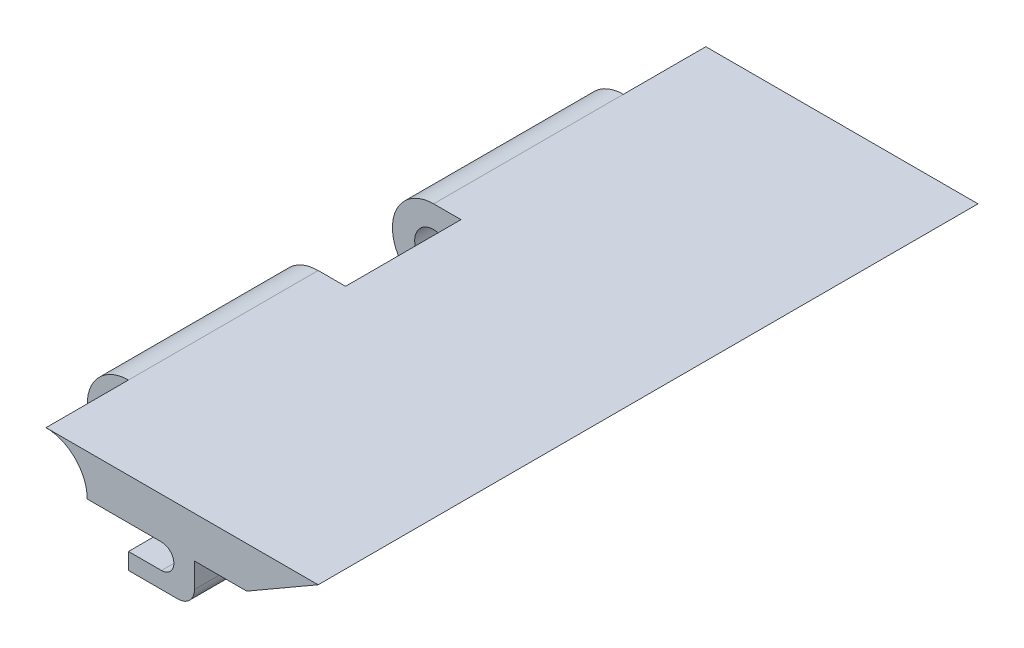
ISO-10303-21;
HEADER;
FILE_DESCRIPTION(('STEP AP214'),'2;1');
FILE_NAME('part.step','',(''),(''),'','','');
FILE_SCHEMA(('AUTOMOTIVE_DESIGN { 1 0 10303 214 1 1 1 1 }'));
ENDSEC;
DATA;
#1=APPLICATION_CONTEXT('core data for automotive mechanical design processes');
#2=APPLICATION_PROTOCOL_DEFINITION('international standard','automotive_design',2000,#1);
#3=PRODUCT_CONTEXT('',#1,'mechanical');
#4=PRODUCT('Part','Part','',(#3));
#5=PRODUCT_RELATED_PRODUCT_CATEGORY('part','',(#4));
#6=PRODUCT_DEFINITION_FORMATION('','',#4);
#7=PRODUCT_DEFINITION_CONTEXT('part definition',#1,'design');
#8=PRODUCT_DEFINITION('design','',#6,#7);
#9=PRODUCT_DEFINITION_SHAPE('','',#8);
#10=(LENGTH_UNIT() NAMED_UNIT(*) SI_UNIT(.MILLI.,.METRE.));
#11=(NAMED_UNIT(*) PLANE_ANGLE_UNIT() SI_UNIT($,.RADIAN.));
#12=(NAMED_UNIT(*) SI_UNIT($,.STERADIAN.) SOLID_ANGLE_UNIT());
#13=UNCERTAINTY_MEASURE_WITH_UNIT(LENGTH_MEASURE(1.E-05),#10,'distance_accuracy_value','');
#14=(GEOMETRIC_REPRESENTATION_CONTEXT(3) GLOBAL_UNCERTAINTY_ASSIGNED_CONTEXT((#13)) GLOBAL_UNIT_ASSIGNED_CONTEXT((#10,
#11,#12)) REPRESENTATION_CONTEXT('',''));
#15=CARTESIAN_POINT('',(0.,0.,0.));
#16=DIRECTION('',(0.,0.,1.));
#17=DIRECTION('',(1.,0.,0.));
#18=AXIS2_PLACEMENT_3D('',#15,#16,#17);
#19=CARTESIAN_POINT('',(7.,-0.75,20.));
#20=DIRECTION('',(0.,0.,-1.));
#21=DIRECTION('',(-1.,0.,0.));
#22=AXIS2_PLACEMENT_3D('',#19,#20,#21);
#23=CYLINDRICAL_SURFACE('',#22,0.75);
#24=CARTESIAN_POINT('',(7.,-0.75,-12.));
#25=DIRECTION('',(0.,0.,-1.));
#26=DIRECTION('',(-1.,0.,0.));
#27=AXIS2_PLACEMENT_3D('',#24,#25,#26);
#28=CIRCLE('',#27,0.75);
#29=CARTESIAN_POINT('',(7.,-1.5,-12.));
#30=VERTEX_POINT('',#29);
#31=CARTESIAN_POINT('',(7.,0.,-12.));
#32=VERTEX_POINT('',#31);
#33=EDGE_CURVE('E450',#30,#32,#28,.F.);
#34=ORIENTED_EDGE('',*,*,#33,.F.);
#35=DIRECTION('',(0.,0.,-1.));
#36=VECTOR('',#35,1.);
#37=CARTESIAN_POINT('',(7.,-1.5,20.));
#38=LINE('',#37,#36);
#39=CARTESIAN_POINT('',(7.,-1.5,12.));
#40=VERTEX_POINT('',#39);
#41=EDGE_CURVE('E257',#40,#30,#38,.T.);
#42=ORIENTED_EDGE('',*,*,#41,.F.);
#43=CARTESIAN_POINT('',(7.,-0.75,12.));
#44=DIRECTION('',(0.,0.,1.));
#45=DIRECTION('',(1.,0.,0.));
#46=AXIS2_PLACEMENT_3D('',#43,#44,#45);
#47=CIRCLE('',#46,0.75);
#48=CARTESIAN_POINT('',(7.,0.,12.));
#49=VERTEX_POINT('',#48);
#50=EDGE_CURVE('E244',#49,#40,#47,.F.);
#51=ORIENTED_EDGE('',*,*,#50,.F.);
#52=DIRECTION('',(0.,0.,-1.));
#53=VECTOR('',#52,1.);
#54=CARTESIAN_POINT('',(7.,0.,20.));
#55=LINE('',#54,#53);
#56=EDGE_CURVE('E255',#49,#32,#55,.T.);
#57=ORIENTED_EDGE('',*,*,#56,.T.);
#58=EDGE_LOOP('',(#34,#42,#51,#57));
#59=FACE_BOUND('',#58,.T.);
#60=ADVANCED_FACE('F41',(#59),#23,.F.);
#61=CARTESIAN_POINT('',(7.,-0.75,-15.));
#62=DIRECTION('',(0.,0.,1.));
#63=DIRECTION('',(1.,0.,0.));
#64=AXIS2_PLACEMENT_3D('',#61,#62,#63);
#65=CIRCLE('',#64,0.75);
#66=CARTESIAN_POINT('',(7.,0.,-15.));
#67=VERTEX_POINT('',#66);
#68=CARTESIAN_POINT('',(7.,-1.5,-15.));
#69=VERTEX_POINT('',#68);
#70=EDGE_CURVE('E440',#67,#69,#65,.F.);
#71=ORIENTED_EDGE('',*,*,#70,.F.);
#72=CARTESIAN_POINT('',(7.,0.,-20.));
#73=VERTEX_POINT('',#72);
#74=EDGE_CURVE('E265',#67,#73,#55,.T.);
#75=ORIENTED_EDGE('',*,*,#74,.T.);
#76=CARTESIAN_POINT('',(7.,-0.75,-20.));
#77=DIRECTION('',(0.,0.,-1.));
#78=DIRECTION('',(-1.,0.,0.));
#79=AXIS2_PLACEMENT_3D('',#76,#77,#78);
#80=CIRCLE('',#79,0.75);
#81=CARTESIAN_POINT('',(7.,-1.5,-20.));
#82=VERTEX_POINT('',#81);
#83=EDGE_CURVE('E484',#73,#82,#80,.T.);
#84=ORIENTED_EDGE('',*,*,#83,.T.);
#85=EDGE_CURVE('E404',#69,#82,#38,.T.);
#86=ORIENTED_EDGE('',*,*,#85,.F.);
#87=EDGE_LOOP('',(#71,#75,#84,#86));
#88=FACE_BOUND('',#87,.T.);
#89=ADVANCED_FACE('F571',(#88),#23,.F.);
#90=CARTESIAN_POINT('',(7.,-0.75,15.));
#91=DIRECTION('',(0.,0.,-1.));
#92=DIRECTION('',(-1.,0.,0.));
#93=AXIS2_PLACEMENT_3D('',#90,#91,#92);
#94=CIRCLE('',#93,0.75);
#95=CARTESIAN_POINT('',(7.,-1.5,15.));
#96=VERTEX_POINT('',#95);
#97=CARTESIAN_POINT('',(7.,0.,15.));
#98=VERTEX_POINT('',#97);
#99=EDGE_CURVE('E426',#96,#98,#94,.F.);
#100=ORIENTED_EDGE('',*,*,#99,.F.);
#101=CARTESIAN_POINT('',(7.,-1.5,20.));
#102=VERTEX_POINT('',#101);
#103=EDGE_CURVE('E269',#102,#96,#38,.T.);
#104=ORIENTED_EDGE('',*,*,#103,.F.);
#105=CARTESIAN_POINT('',(7.,-0.75,20.));
#106=DIRECTION('',(0.,0.,-1.));
#107=DIRECTION('',(-1.,0.,0.));
#108=AXIS2_PLACEMENT_3D('',#105,#106,#107);
#109=CIRCLE('',#108,0.75);
#110=CARTESIAN_POINT('',(7.,0.,20.));
#111=VERTEX_POINT('',#110);
#112=EDGE_CURVE('E425',#111,#102,#109,.T.);
#113=ORIENTED_EDGE('',*,*,#112,.F.);
#114=EDGE_CURVE('E264',#111,#98,#55,.T.);
#115=ORIENTED_EDGE('',*,*,#114,.T.);
#116=EDGE_LOOP('',(#100,#104,#113,#115));
#117=FACE_BOUND('',#116,.T.);
#118=ADVANCED_FACE('F424',(#117),#23,.F.);
#119=CARTESIAN_POINT('',(7.,-1.5,20.));
#120=DIRECTION('',(0.,-1.,0.));
#121=DIRECTION('',(1.,0.,0.));
#122=AXIS2_PLACEMENT_3D('',#119,#120,#121);
#123=PLANE('',#122);
#124=DIRECTION('',(1.,0.,0.));
#125=VECTOR('',#124,1.);
#126=CARTESIAN_POINT('',(7.00000000000001,-1.5,-12.));
#127=LINE('',#126,#125);
#128=CARTESIAN_POINT('',(5.,-1.5,-12.));
#129=VERTEX_POINT('',#128);
#130=EDGE_CURVE('E448',#129,#30,#127,.T.);
#131=ORIENTED_EDGE('',*,*,#130,.F.);
#132=DIRECTION('',(0.,0.,-1.));
#133=VECTOR('',#132,1.);
#134=CARTESIAN_POINT('',(5.,-1.5,20.));
#135=LINE('',#134,#133);
#136=CARTESIAN_POINT('',(5.,-1.5,12.));
#137=VERTEX_POINT('',#136);
#138=EDGE_CURVE('E396',#137,#129,#135,.T.);
#139=ORIENTED_EDGE('',*,*,#138,.F.);
#140=DIRECTION('',(-1.,0.,0.));
#141=VECTOR('',#140,1.);
#142=CARTESIAN_POINT('',(7.,-1.5,12.));
#143=LINE('',#142,#141);
#144=EDGE_CURVE('E259',#40,#137,#143,.T.);
#145=ORIENTED_EDGE('',*,*,#144,.F.);
#146=ORIENTED_EDGE('',*,*,#41,.T.);
#147=EDGE_LOOP('',(#131,#139,#145,#146));
#148=FACE_BOUND('',#147,.T.);
#149=ADVANCED_FACE('F546',(#148),#123,.F.);
#150=DIRECTION('',(-1.,0.,0.));
#151=VECTOR('',#150,1.);
#152=CARTESIAN_POINT('',(6.99999999999999,-1.5,-15.));
#153=LINE('',#152,#151);
#154=CARTESIAN_POINT('',(5.,-1.5,-15.));
#155=VERTEX_POINT('',#154);
#156=EDGE_CURVE('E438',#69,#155,#153,.T.);
#157=ORIENTED_EDGE('',*,*,#156,.F.);
#158=ORIENTED_EDGE('',*,*,#85,.T.);
#159=DIRECTION('',(-1.,0.,0.));
#160=VECTOR('',#159,1.);
#161=CARTESIAN_POINT('',(7.,-1.5,-20.));
#162=LINE('',#161,#160);
#163=CARTESIAN_POINT('',(5.,-1.5,-20.));
#164=VERTEX_POINT('',#163);
#165=EDGE_CURVE('E493',#82,#164,#162,.T.);
#166=ORIENTED_EDGE('',*,*,#165,.T.);
#167=EDGE_CURVE('E391',#155,#164,#135,.T.);
#168=ORIENTED_EDGE('',*,*,#167,.F.);
#169=EDGE_LOOP('',(#157,#158,#166,#168));
#170=FACE_BOUND('',#169,.T.);
#171=ADVANCED_FACE('F584',(#170),#123,.F.);
#172=DIRECTION('',(1.,0.,0.));
#173=VECTOR('',#172,1.);
#174=CARTESIAN_POINT('',(7.,-1.5,15.));
#175=LINE('',#174,#173);
#176=CARTESIAN_POINT('',(5.,-1.5,15.));
#177=VERTEX_POINT('',#176);
#178=EDGE_CURVE('E419',#177,#96,#175,.T.);
#179=ORIENTED_EDGE('',*,*,#178,.F.);
#180=CARTESIAN_POINT('',(5.,-1.5,20.));
#181=VERTEX_POINT('',#180);
#182=EDGE_CURVE('E397',#181,#177,#135,.T.);
#183=ORIENTED_EDGE('',*,*,#182,.F.);
#184=DIRECTION('',(-1.,0.,0.));
#185=VECTOR('',#184,1.);
#186=CARTESIAN_POINT('',(7.,-1.5,20.));
#187=LINE('',#186,#185);
#188=EDGE_CURVE('E420',#102,#181,#187,.T.);
#189=ORIENTED_EDGE('',*,*,#188,.F.);
#190=ORIENTED_EDGE('',*,*,#103,.T.);
#191=EDGE_LOOP('',(#179,#183,#189,#190));
#192=FACE_BOUND('',#191,.T.);
#193=ADVANCED_FACE('F418',(#192),#123,.F.);
#194=CARTESIAN_POINT('',(5.,-1.5,20.));
#195=DIRECTION('',(1.,0.,0.));
#196=DIRECTION('',(0.,0.,-1.));
#197=AXIS2_PLACEMENT_3D('',#194,#195,#196);
#198=PLANE('',#197);
#199=DIRECTION('',(0.,1.,0.));
#200=VECTOR('',#199,1.);
#201=CARTESIAN_POINT('',(5.,-1.5,-12.));
#202=LINE('',#201,#200);
#203=CARTESIAN_POINT('',(5.,-2.5,-12.));
#204=VERTEX_POINT('',#203);
#205=EDGE_CURVE('E446',#204,#129,#202,.T.);
#206=ORIENTED_EDGE('',*,*,#205,.F.);
#207=DIRECTION('',(0.,0.,-1.));
#208=VECTOR('',#207,1.);
#209=CARTESIAN_POINT('',(5.,-2.5,20.));
#210=LINE('',#209,#208);
#211=CARTESIAN_POINT('',(5.,-2.5,12.));
#212=VERTEX_POINT('',#211);
#213=EDGE_CURVE('E383',#212,#204,#210,.T.);
#214=ORIENTED_EDGE('',*,*,#213,.F.);
#215=DIRECTION('',(0.,-1.,0.));
#216=VECTOR('',#215,1.);
#217=CARTESIAN_POINT('',(5.,-1.5,12.));
#218=LINE('',#217,#216);
#219=EDGE_CURVE('E536',#137,#212,#218,.T.);
#220=ORIENTED_EDGE('',*,*,#219,.F.);
#221=ORIENTED_EDGE('',*,*,#138,.T.);
#222=EDGE_LOOP('',(#206,#214,#220,#221));
#223=FACE_BOUND('',#222,.T.);
#224=ADVANCED_FACE('F544',(#223),#198,.F.);
#225=DIRECTION('',(0.,-1.,0.));
#226=VECTOR('',#225,1.);
#227=CARTESIAN_POINT('',(5.,-1.5,-15.));
#228=LINE('',#227,#226);
#229=CARTESIAN_POINT('',(5.,-2.5,-15.));
#230=VERTEX_POINT('',#229);
#231=EDGE_CURVE('E436',#155,#230,#228,.T.);
#232=ORIENTED_EDGE('',*,*,#231,.F.);
#233=ORIENTED_EDGE('',*,*,#167,.T.);
#234=DIRECTION('',(0.,-1.,0.));
#235=VECTOR('',#234,1.);
#236=CARTESIAN_POINT('',(5.,-1.5,-20.));
#237=LINE('',#236,#235);
#238=CARTESIAN_POINT('',(5.,-2.5,-20.));
#239=VERTEX_POINT('',#238);
#240=EDGE_CURVE('E495',#164,#239,#237,.T.);
#241=ORIENTED_EDGE('',*,*,#240,.T.);
#242=EDGE_CURVE('E378',#230,#239,#210,.T.);
#243=ORIENTED_EDGE('',*,*,#242,.F.);
#244=EDGE_LOOP('',(#232,#233,#241,#243));
#245=FACE_BOUND('',#244,.T.);
#246=ADVANCED_FACE('F593',(#245),#198,.F.);
#247=DIRECTION('',(0.,1.,0.));
#248=VECTOR('',#247,1.);
#249=CARTESIAN_POINT('',(5.,-1.5,15.));
#250=LINE('',#249,#248);
#251=CARTESIAN_POINT('',(5.,-2.5,15.));
#252=VERTEX_POINT('',#251);
#253=EDGE_CURVE('E431',#252,#177,#250,.T.);
#254=ORIENTED_EDGE('',*,*,#253,.F.);
#255=CARTESIAN_POINT('',(5.,-2.5,20.));
#256=VERTEX_POINT('',#255);
#257=EDGE_CURVE('E384',#256,#252,#210,.T.);
#258=ORIENTED_EDGE('',*,*,#257,.F.);
#259=DIRECTION('',(0.,-1.,0.));
#260=VECTOR('',#259,1.);
#261=CARTESIAN_POINT('',(5.,-1.5,20.));
#262=LINE('',#261,#260);
#263=EDGE_CURVE('E487',#181,#256,#262,.T.);
#264=ORIENTED_EDGE('',*,*,#263,.F.);
#265=ORIENTED_EDGE('',*,*,#182,.T.);
#266=EDGE_LOOP('',(#254,#258,#264,#265));
#267=FACE_BOUND('',#266,.T.);
#268=ADVANCED_FACE('F525',(#267),#198,.F.);
#269=CARTESIAN_POINT('',(5.,-2.5,20.));
#270=DIRECTION('',(0.,1.,0.));
#271=DIRECTION('',(-1.,0.,0.));
#272=AXIS2_PLACEMENT_3D('',#269,#270,#271);
#273=PLANE('',#272);
#274=DIRECTION('',(-1.,0.,0.));
#275=VECTOR('',#274,1.);
#276=CARTESIAN_POINT('',(5.00000000000001,-2.5,-12.));
#277=LINE('',#276,#275);
#278=CARTESIAN_POINT('',(8.,-2.5,-12.));
#279=VERTEX_POINT('',#278);
#280=EDGE_CURVE('E444',#279,#204,#277,.T.);
#281=ORIENTED_EDGE('',*,*,#280,.F.);
#282=DIRECTION('',(0.,0.,-1.));
#283=VECTOR('',#282,1.);
#284=CARTESIAN_POINT('',(8.,-2.5,20.));
#285=LINE('',#284,#283);
#286=CARTESIAN_POINT('',(8.,-2.5,12.));
#287=VERTEX_POINT('',#286);
#288=EDGE_CURVE('E370',#287,#279,#285,.T.);
#289=ORIENTED_EDGE('',*,*,#288,.F.);
#290=DIRECTION('',(1.,0.,0.));
#291=VECTOR('',#290,1.);
#292=CARTESIAN_POINT('',(5.,-2.5,12.));
#293=LINE('',#292,#291);
#294=EDGE_CURVE('E534',#212,#287,#293,.T.);
#295=ORIENTED_EDGE('',*,*,#294,.F.);
#296=ORIENTED_EDGE('',*,*,#213,.T.);
#297=EDGE_LOOP('',(#281,#289,#295,#296));
#298=FACE_BOUND('',#297,.T.);
#299=ADVANCED_FACE('F551',(#298),#273,.F.);
#300=DIRECTION('',(1.,0.,0.));
#301=VECTOR('',#300,1.);
#302=CARTESIAN_POINT('',(4.99999999999999,-2.5,-15.));
#303=LINE('',#302,#301);
#304=CARTESIAN_POINT('',(8.,-2.5,-15.));
#305=VERTEX_POINT('',#304);
#306=EDGE_CURVE('E429',#230,#305,#303,.T.);
#307=ORIENTED_EDGE('',*,*,#306,.F.);
#308=ORIENTED_EDGE('',*,*,#242,.T.);
#309=DIRECTION('',(1.,0.,0.));
#310=VECTOR('',#309,1.);
#311=CARTESIAN_POINT('',(5.,-2.5,-20.));
#312=LINE('',#311,#310);
#313=CARTESIAN_POINT('',(8.,-2.5,-20.));
#314=VERTEX_POINT('',#313);
#315=EDGE_CURVE('E497',#239,#314,#312,.T.);
#316=ORIENTED_EDGE('',*,*,#315,.T.);
#317=EDGE_CURVE('E365',#305,#314,#285,.T.);
#318=ORIENTED_EDGE('',*,*,#317,.F.);
#319=EDGE_LOOP('',(#307,#308,#316,#318));
#320=FACE_BOUND('',#319,.T.);
#321=ADVANCED_FACE('F602',(#320),#273,.F.);
#322=DIRECTION('',(-1.,0.,0.));
#323=VECTOR('',#322,1.);
#324=CARTESIAN_POINT('',(5.,-2.5,15.));
#325=LINE('',#324,#323);
#326=CARTESIAN_POINT('',(8.,-2.5,15.));
#327=VERTEX_POINT('',#326);
#328=EDGE_CURVE('E521',#327,#252,#325,.T.);
#329=ORIENTED_EDGE('',*,*,#328,.F.);
#330=CARTESIAN_POINT('',(8.,-2.5,20.));
#331=VERTEX_POINT('',#330);
#332=EDGE_CURVE('E371',#331,#327,#285,.T.);
#333=ORIENTED_EDGE('',*,*,#332,.F.);
#334=DIRECTION('',(1.,0.,0.));
#335=VECTOR('',#334,1.);
#336=CARTESIAN_POINT('',(5.,-2.5,20.));
#337=LINE('',#336,#335);
#338=EDGE_CURVE('E489',#256,#331,#337,.T.);
#339=ORIENTED_EDGE('',*,*,#338,.F.);
#340=ORIENTED_EDGE('',*,*,#257,.T.);
#341=EDGE_LOOP('',(#329,#333,#339,#340));
#342=FACE_BOUND('',#341,.T.);
#343=ADVANCED_FACE('F526',(#342),#273,.F.);
#344=CARTESIAN_POINT('',(8.,-1.5,20.));
#345=DIRECTION('',(0.,0.,-1.));
#346=DIRECTION('',(-1.,0.,0.));
#347=AXIS2_PLACEMENT_3D('',#344,#345,#346);
#348=CYLINDRICAL_SURFACE('',#347,1.);
#349=CARTESIAN_POINT('',(8.,-1.5,-12.));
#350=DIRECTION('',(0.,0.,-1.));
#351=DIRECTION('',(-1.,0.,0.));
#352=AXIS2_PLACEMENT_3D('',#349,#350,#351);
#353=CIRCLE('',#352,1.);
#354=CARTESIAN_POINT('',(9.,-1.5,-12.));
#355=VERTEX_POINT('',#354);
#356=EDGE_CURVE('E442',#355,#279,#353,.T.);
#357=ORIENTED_EDGE('',*,*,#356,.F.);
#358=DIRECTION('',(0.,0.,-1.));
#359=VECTOR('',#358,1.);
#360=CARTESIAN_POINT('',(9.,-1.5,20.));
#361=LINE('',#360,#359);
#362=CARTESIAN_POINT('',(9.,-1.5,12.));
#363=VERTEX_POINT('',#362);
#364=EDGE_CURVE('E359',#363,#355,#361,.T.);
#365=ORIENTED_EDGE('',*,*,#364,.F.);
#366=CARTESIAN_POINT('',(8.,-1.5,12.));
#367=DIRECTION('',(0.,0.,1.));
#368=DIRECTION('',(1.,0.,0.));
#369=AXIS2_PLACEMENT_3D('',#366,#367,#368);
#370=CIRCLE('',#369,1.);
#371=EDGE_CURVE('E532',#287,#363,#370,.T.);
#372=ORIENTED_EDGE('',*,*,#371,.F.);
#373=ORIENTED_EDGE('',*,*,#288,.T.);
#374=EDGE_LOOP('',(#357,#365,#372,#373));
#375=FACE_BOUND('',#374,.T.);
#376=ADVANCED_FACE('F557',(#375),#348,.T.);
#377=CARTESIAN_POINT('',(8.,-1.5,-15.));
#378=DIRECTION('',(0.,0.,1.));
#379=DIRECTION('',(1.,0.,0.));
#380=AXIS2_PLACEMENT_3D('',#377,#378,#379);
#381=CIRCLE('',#380,1.);
#382=CARTESIAN_POINT('',(9.,-1.5,-15.));
#383=VERTEX_POINT('',#382);
#384=EDGE_CURVE('E336',#305,#383,#381,.T.);
#385=ORIENTED_EDGE('',*,*,#384,.F.);
#386=ORIENTED_EDGE('',*,*,#317,.T.);
#387=CARTESIAN_POINT('',(8.,-1.5,-20.));
#388=DIRECTION('',(0.,0.,1.));
#389=DIRECTION('',(-1.,0.,0.));
#390=AXIS2_PLACEMENT_3D('',#387,#388,#389);
#391=CIRCLE('',#390,1.);
#392=CARTESIAN_POINT('',(9.,-1.5,-20.));
#393=VERTEX_POINT('',#392);
#394=EDGE_CURVE('E499',#314,#393,#391,.T.);
#395=ORIENTED_EDGE('',*,*,#394,.T.);
#396=EDGE_CURVE('E356',#383,#393,#361,.T.);
#397=ORIENTED_EDGE('',*,*,#396,.F.);
#398=EDGE_LOOP('',(#385,#386,#395,#397));
#399=FACE_BOUND('',#398,.T.);
#400=ADVANCED_FACE('F501',(#399),#348,.T.);
#401=CARTESIAN_POINT('',(8.,-1.5,15.));
#402=DIRECTION('',(0.,0.,-1.));
#403=DIRECTION('',(-1.,0.,0.));
#404=AXIS2_PLACEMENT_3D('',#401,#402,#403);
#405=CIRCLE('',#404,1.);
#406=CARTESIAN_POINT('',(9.,-1.5,15.));
#407=VERTEX_POINT('',#406);
#408=EDGE_CURVE('E258',#407,#327,#405,.T.);
#409=ORIENTED_EDGE('',*,*,#408,.F.);
#410=CARTESIAN_POINT('',(9.,-1.5,20.));
#411=VERTEX_POINT('',#410);
#412=EDGE_CURVE('E360',#411,#407,#361,.T.);
#413=ORIENTED_EDGE('',*,*,#412,.F.);
#414=CARTESIAN_POINT('',(8.,-1.5,20.));
#415=DIRECTION('',(0.,0.,1.));
#416=DIRECTION('',(-1.,0.,0.));
#417=AXIS2_PLACEMENT_3D('',#414,#415,#416);
#418=CIRCLE('',#417,1.);
#419=EDGE_CURVE('E351',#331,#411,#418,.T.);
#420=ORIENTED_EDGE('',*,*,#419,.F.);
#421=ORIENTED_EDGE('',*,*,#332,.T.);
#422=EDGE_LOOP('',(#409,#413,#420,#421));
#423=FACE_BOUND('',#422,.T.);
#424=ADVANCED_FACE('F520',(#423),#348,.T.);
#425=CARTESIAN_POINT('',(9.,-1.5,20.));
#426=DIRECTION('',(-1.,0.,0.));
#427=DIRECTION('',(0.,0.,1.));
#428=AXIS2_PLACEMENT_3D('',#425,#426,#427);
#429=PLANE('',#428);
#430=DIRECTION('',(0.,-1.,0.));
#431=VECTOR('',#430,1.);
#432=CARTESIAN_POINT('',(9.,-1.5,-12.));
#433=LINE('',#432,#431);
#434=CARTESIAN_POINT('',(9.,0.,-12.));
#435=VERTEX_POINT('',#434);
#436=EDGE_CURVE('E11',#435,#355,#433,.T.);
#437=ORIENTED_EDGE('',*,*,#436,.F.);
#438=DIRECTION('',(0.,0.,-1.));
#439=VECTOR('',#438,1.);
#440=CARTESIAN_POINT('',(9.,0.,20.));
#441=LINE('',#440,#439);
#442=CARTESIAN_POINT('',(9.,0.,12.));
#443=VERTEX_POINT('',#442);
#444=EDGE_CURVE('E346',#443,#435,#441,.T.);
#445=ORIENTED_EDGE('',*,*,#444,.F.);
#446=DIRECTION('',(0.,1.,0.));
#447=VECTOR('',#446,1.);
#448=CARTESIAN_POINT('',(9.,-1.5,12.));
#449=LINE('',#448,#447);
#450=EDGE_CURVE('E247',#363,#443,#449,.T.);
#451=ORIENTED_EDGE('',*,*,#450,.F.);
#452=ORIENTED_EDGE('',*,*,#364,.T.);
#453=EDGE_LOOP('',(#437,#445,#451,#452));
#454=FACE_BOUND('',#453,.T.);
#455=ADVANCED_FACE('F560',(#454),#429,.F.);
#456=DIRECTION('',(0.,1.,0.));
#457=VECTOR('',#456,1.);
#458=CARTESIAN_POINT('',(9.,-1.5,-15.));
#459=LINE('',#458,#457);
#460=CARTESIAN_POINT('',(9.,0.,-15.));
#461=VERTEX_POINT('',#460);
#462=EDGE_CURVE('E49',#383,#461,#459,.T.);
#463=ORIENTED_EDGE('',*,*,#462,.F.);
#464=ORIENTED_EDGE('',*,*,#396,.T.);
#465=DIRECTION('',(0.,1.,0.));
#466=VECTOR('',#465,1.);
#467=CARTESIAN_POINT('',(9.,-1.5,-20.));
#468=LINE('',#467,#466);
#469=CARTESIAN_POINT('',(9.,0.,-20.));
#470=VERTEX_POINT('',#469);
#471=EDGE_CURVE('E343',#393,#470,#468,.T.);
#472=ORIENTED_EDGE('',*,*,#471,.T.);
#473=EDGE_CURVE('E340',#461,#470,#441,.T.);
#474=ORIENTED_EDGE('',*,*,#473,.F.);
#475=EDGE_LOOP('',(#463,#464,#472,#474));
#476=FACE_BOUND('',#475,.T.);
#477=ADVANCED_FACE('F341',(#476),#429,.F.);
#478=DIRECTION('',(0.,-1.,0.));
#479=VECTOR('',#478,1.);
#480=CARTESIAN_POINT('',(9.,-1.5,15.));
#481=LINE('',#480,#479);
#482=CARTESIAN_POINT('',(9.,0.,15.));
#483=VERTEX_POINT('',#482);
#484=EDGE_CURVE('E329',#483,#407,#481,.T.);
#485=ORIENTED_EDGE('',*,*,#484,.F.);
#486=CARTESIAN_POINT('',(9.,0.,20.));
#487=VERTEX_POINT('',#486);
#488=EDGE_CURVE('E349',#487,#483,#441,.T.);
#489=ORIENTED_EDGE('',*,*,#488,.F.);
#490=DIRECTION('',(0.,1.,0.));
#491=VECTOR('',#490,1.);
#492=CARTESIAN_POINT('',(9.,-1.5,20.));
#493=LINE('',#492,#491);
#494=EDGE_CURVE('E347',#411,#487,#493,.T.);
#495=ORIENTED_EDGE('',*,*,#494,.F.);
#496=ORIENTED_EDGE('',*,*,#412,.T.);
#497=EDGE_LOOP('',(#485,#489,#495,#496));
#498=FACE_BOUND('',#497,.T.);
#499=ADVANCED_FACE('F518',(#498),#429,.F.);
#500=CARTESIAN_POINT('',(0.,0.,20.));
#501=DIRECTION('',(0.,0.,-1.));
#502=DIRECTION('',(-1.,0.,0.));
#503=AXIS2_PLACEMENT_3D('',#500,#501,#502);
#504=CYLINDRICAL_SURFACE('',#503,2.5);
#505=CARTESIAN_POINT('',(0.,0.,15.));
#506=DIRECTION('',(0.,0.,1.));
#507=DIRECTION('',(1.,0.,0.));
#508=AXIS2_PLACEMENT_3D('',#505,#506,#507);
#509=CIRCLE('',#508,2.5);
#510=CARTESIAN_POINT('',(0.,2.5,15.));
#511=VERTEX_POINT('',#510);
#512=CARTESIAN_POINT('',(2.5,0.,15.));
#513=VERTEX_POINT('',#512);
#514=EDGE_CURVE('E454',#511,#513,#509,.T.);
#515=ORIENTED_EDGE('',*,*,#514,.F.);
#516=DIRECTION('',(0.,0.,-1.));
#517=VECTOR('',#516,1.);
#518=CARTESIAN_POINT('',(0.,2.5,20.));
#519=LINE('',#518,#517);
#520=CARTESIAN_POINT('',(0.,2.5,3.5));
#521=VERTEX_POINT('',#520);
#522=EDGE_CURVE('E295',#511,#521,#519,.T.);
#523=ORIENTED_EDGE('',*,*,#522,.T.);
#524=CARTESIAN_POINT('',(0.,0.,3.5));
#525=DIRECTION('',(0.,0.,1.));
#526=DIRECTION('',(1.,0.,0.));
#527=AXIS2_PLACEMENT_3D('',#524,#525,#526);
#528=CIRCLE('',#527,2.5);
#529=CARTESIAN_POINT('',(2.5,0.,3.5));
#530=VERTEX_POINT('',#529);
#531=EDGE_CURVE('E471',#521,#530,#528,.T.);
#532=ORIENTED_EDGE('',*,*,#531,.T.);
#533=DIRECTION('',(0.,0.,-1.));
#534=VECTOR('',#533,1.);
#535=CARTESIAN_POINT('',(2.5,0.,20.));
#536=LINE('',#535,#534);
#537=EDGE_CURVE('E305',#513,#530,#536,.T.);
#538=ORIENTED_EDGE('',*,*,#537,.F.);
#539=EDGE_LOOP('',(#515,#523,#532,#538));
#540=FACE_BOUND('',#539,.T.);
#541=ADVANCED_FACE('F43',(#540),#504,.T.);
#542=CARTESIAN_POINT('',(0.,0.,20.));
#543=DIRECTION('',(0.,0.,-1.));
#544=DIRECTION('',(-1.,0.,0.));
#545=AXIS2_PLACEMENT_3D('',#542,#543,#544);
#546=CYLINDRICAL_SURFACE('',#545,1.15);
#547=CARTESIAN_POINT('',(0.,0.,3.5));
#548=DIRECTION('',(0.,0.,1.));
#549=DIRECTION('',(1.,0.,0.));
#550=AXIS2_PLACEMENT_3D('',#547,#548,#549);
#551=CIRCLE('',#550,1.15);
#552=CARTESIAN_POINT('',(1.15,0.,3.5));
#553=VERTEX_POINT('',#552);
#554=EDGE_CURVE('E306',#553,#553,#551,.T.);
#555=ORIENTED_EDGE('',*,*,#554,.F.);
#556=EDGE_LOOP('',(#555));
#557=FACE_BOUND('',#556,.T.);
#558=CARTESIAN_POINT('',(0.,0.,15.));
#559=DIRECTION('',(0.,0.,1.));
#560=DIRECTION('',(1.,0.,0.));
#561=AXIS2_PLACEMENT_3D('',#558,#559,#560);
#562=CIRCLE('',#561,1.15);
#563=CARTESIAN_POINT('',(1.15,0.,15.));
#564=VERTEX_POINT('',#563);
#565=EDGE_CURVE('E323',#564,#564,#562,.T.);
#566=ORIENTED_EDGE('',*,*,#565,.T.);
#567=EDGE_LOOP('',(#566));
#568=FACE_BOUND('',#567,.T.);
#569=ADVANCED_FACE('F740',(#557,#568),#546,.F.);
#570=CARTESIAN_POINT('',(0.,0.,-15.));
#571=DIRECTION('',(0.,0.,-1.));
#572=DIRECTION('',(-1.,0.,0.));
#573=AXIS2_PLACEMENT_3D('',#570,#571,#572);
#574=CIRCLE('',#573,2.5);
#575=CARTESIAN_POINT('',(2.5,0.,-15.));
#576=VERTEX_POINT('',#575);
#577=CARTESIAN_POINT('',(0.,2.5,-15.));
#578=VERTEX_POINT('',#577);
#579=EDGE_CURVE('E460',#576,#578,#574,.T.);
#580=ORIENTED_EDGE('',*,*,#579,.F.);
#581=CARTESIAN_POINT('',(2.5,0.,-3.5));
#582=VERTEX_POINT('',#581);
#583=EDGE_CURVE('E300',#582,#576,#536,.T.);
#584=ORIENTED_EDGE('',*,*,#583,.F.);
#585=CARTESIAN_POINT('',(0.,0.,-3.5));
#586=DIRECTION('',(0.,0.,1.));
#587=DIRECTION('',(1.,0.,0.));
#588=AXIS2_PLACEMENT_3D('',#585,#586,#587);
#589=CIRCLE('',#588,2.5);
#590=CARTESIAN_POINT('',(0.,2.5,-3.5));
#591=VERTEX_POINT('',#590);
#592=EDGE_CURVE('E477',#591,#582,#589,.T.);
#593=ORIENTED_EDGE('',*,*,#592,.F.);
#594=EDGE_CURVE('E282',#591,#578,#519,.T.);
#595=ORIENTED_EDGE('',*,*,#594,.T.);
#596=EDGE_LOOP('',(#580,#584,#593,#595));
#597=FACE_BOUND('',#596,.T.);
#598=ADVANCED_FACE('F735',(#597),#504,.T.);
#599=CARTESIAN_POINT('',(0.,0.,-3.5));
#600=DIRECTION('',(0.,0.,1.));
#601=DIRECTION('',(1.,0.,0.));
#602=AXIS2_PLACEMENT_3D('',#599,#600,#601);
#603=CIRCLE('',#602,1.15);
#604=CARTESIAN_POINT('',(1.15,0.,-3.5));
#605=VERTEX_POINT('',#604);
#606=EDGE_CURVE('E311',#605,#605,#603,.T.);
#607=ORIENTED_EDGE('',*,*,#606,.T.);
#608=EDGE_LOOP('',(#607));
#609=FACE_BOUND('',#608,.T.);
#610=CARTESIAN_POINT('',(0.,0.,-15.));
#611=DIRECTION('',(0.,0.,-1.));
#612=DIRECTION('',(-1.,0.,0.));
#613=AXIS2_PLACEMENT_3D('',#610,#611,#612);
#614=CIRCLE('',#613,1.15);
#615=CARTESIAN_POINT('',(-1.15,0.,-15.));
#616=VERTEX_POINT('',#615);
#617=EDGE_CURVE('E318',#616,#616,#614,.T.);
#618=ORIENTED_EDGE('',*,*,#617,.T.);
#619=EDGE_LOOP('',(#618));
#620=FACE_BOUND('',#619,.T.);
#621=ADVANCED_FACE('F739',(#609,#620),#546,.F.);
#622=CARTESIAN_POINT('',(16.5,2.5,20.));
#623=DIRECTION('',(0.,-1.,0.));
#624=DIRECTION('',(1.,0.,0.));
#625=AXIS2_PLACEMENT_3D('',#622,#623,#624);
#626=PLANE('',#625);
#627=DIRECTION('',(-1.,0.,0.));
#628=VECTOR('',#627,1.);
#629=CARTESIAN_POINT('',(16.5,2.5,-3.5));
#630=LINE('',#629,#628);
#631=CARTESIAN_POINT('',(1.6583123951777,2.5,-3.5));
#632=VERTEX_POINT('',#631);
#633=EDGE_CURVE('E314',#632,#591,#630,.T.);
#634=ORIENTED_EDGE('',*,*,#633,.F.);
#635=DIRECTION('',(0.,0.,1.));
#636=VECTOR('',#635,1.);
#637=CARTESIAN_POINT('',(1.6583123951777,2.5,-3.5));
#638=LINE('',#637,#636);
#639=CARTESIAN_POINT('',(1.6583123951777,2.5,3.5));
#640=VERTEX_POINT('',#639);
#641=EDGE_CURVE('E304',#632,#640,#638,.T.);
#642=ORIENTED_EDGE('',*,*,#641,.T.);
#643=DIRECTION('',(-1.,0.,0.));
#644=VECTOR('',#643,1.);
#645=CARTESIAN_POINT('',(16.5,2.5,3.5));
#646=LINE('',#645,#644);
#647=EDGE_CURVE('E309',#640,#521,#646,.T.);
#648=ORIENTED_EDGE('',*,*,#647,.T.);
#649=ORIENTED_EDGE('',*,*,#522,.F.);
#650=CARTESIAN_POINT('',(0.,2.5,20.));
#651=VERTEX_POINT('',#650);
#652=EDGE_CURVE('E291',#651,#511,#519,.T.);
#653=ORIENTED_EDGE('',*,*,#652,.F.);
#654=DIRECTION('',(-1.,0.,0.));
#655=VECTOR('',#654,1.);
#656=CARTESIAN_POINT('',(16.5,2.5,20.));
#657=LINE('',#656,#655);
#658=CARTESIAN_POINT('',(16.5,2.5,20.));
#659=VERTEX_POINT('',#658);
#660=EDGE_CURVE('E279',#659,#651,#657,.T.);
#661=ORIENTED_EDGE('',*,*,#660,.F.);
#662=DIRECTION('',(0.,0.,-1.));
#663=VECTOR('',#662,1.);
#664=CARTESIAN_POINT('',(16.5,2.5,20.));
#665=LINE('',#664,#663);
#666=CARTESIAN_POINT('',(16.5,2.5,-20.));
#667=VERTEX_POINT('',#666);
#668=EDGE_CURVE('E294',#659,#667,#665,.T.);
#669=ORIENTED_EDGE('',*,*,#668,.T.);
#670=DIRECTION('',(-1.,0.,0.));
#671=VECTOR('',#670,1.);
#672=CARTESIAN_POINT('',(16.5,2.5,-20.));
#673=LINE('',#672,#671);
#674=CARTESIAN_POINT('',(0.,2.5,-20.));
#675=VERTEX_POINT('',#674);
#676=EDGE_CURVE('E288',#667,#675,#673,.T.);
#677=ORIENTED_EDGE('',*,*,#676,.T.);
#678=DIRECTION('',(0.,0.,-1.));
#679=VECTOR('',#678,1.);
#680=CARTESIAN_POINT('',(0.,2.5,-15.));
#681=LINE('',#680,#679);
#682=EDGE_CURVE('E459',#578,#675,#681,.T.);
#683=ORIENTED_EDGE('',*,*,#682,.F.);
#684=ORIENTED_EDGE('',*,*,#594,.F.);
#685=EDGE_LOOP('',(#634,#642,#648,#649,#653,#661,#669,#677,#683,#684));
#686=FACE_BOUND('',#685,.T.);
#687=ADVANCED_FACE('F731',(#686),#626,.F.);
#688=CARTESIAN_POINT('',(2.5,0.,20.));
#689=DIRECTION('',(0.,1.,0.));
#690=DIRECTION('',(0.,0.,1.));
#691=AXIS2_PLACEMENT_3D('',#688,#689,#690);
#692=PLANE('',#691);
#693=ORIENTED_EDGE('',*,*,#583,.T.);
#694=DIRECTION('',(0.,0.,-1.));
#695=VECTOR('',#694,1.);
#696=CARTESIAN_POINT('',(2.5,0.,-15.));
#697=LINE('',#696,#695);
#698=CARTESIAN_POINT('',(2.5,0.,-20.));
#699=VERTEX_POINT('',#698);
#700=EDGE_CURVE('E322',#576,#699,#697,.T.);
#701=ORIENTED_EDGE('',*,*,#700,.T.);
#702=DIRECTION('',(1.,0.,0.));
#703=VECTOR('',#702,1.);
#704=CARTESIAN_POINT('',(2.5,0.,-20.));
#705=LINE('',#704,#703);
#706=EDGE_CURVE('E283',#699,#73,#705,.T.);
#707=ORIENTED_EDGE('',*,*,#706,.T.);
#708=ORIENTED_EDGE('',*,*,#74,.F.);
#709=DIRECTION('',(1.,0.,0.));
#710=VECTOR('',#709,1.);
#711=CARTESIAN_POINT('',(12.1698729810777,0.,-15.));
#712=LINE('',#711,#710);
#713=EDGE_CURVE('E56',#67,#461,#712,.T.);
#714=ORIENTED_EDGE('',*,*,#713,.T.);
#715=ORIENTED_EDGE('',*,*,#473,.T.);
#716=CARTESIAN_POINT('',(12.1698729810777,0.,-20.));
#717=VERTEX_POINT('',#716);
#718=EDGE_CURVE('E268',#470,#717,#705,.T.);
#719=ORIENTED_EDGE('',*,*,#718,.T.);
#720=DIRECTION('',(0.,0.,-1.));
#721=VECTOR('',#720,1.);
#722=CARTESIAN_POINT('',(12.1698729810777,0.,20.));
#723=LINE('',#722,#721);
#724=CARTESIAN_POINT('',(12.1698729810777,0.,20.));
#725=VERTEX_POINT('',#724);
#726=EDGE_CURVE('E298',#725,#717,#723,.T.);
#727=ORIENTED_EDGE('',*,*,#726,.F.);
#728=DIRECTION('',(1.,0.,0.));
#729=VECTOR('',#728,1.);
#730=CARTESIAN_POINT('',(2.5,0.,20.));
#731=LINE('',#730,#729);
#732=EDGE_CURVE('E277',#487,#725,#731,.T.);
#733=ORIENTED_EDGE('',*,*,#732,.F.);
#734=ORIENTED_EDGE('',*,*,#488,.T.);
#735=DIRECTION('',(-1.,0.,0.));
#736=VECTOR('',#735,1.);
#737=CARTESIAN_POINT('',(12.1698729810777,0.,15.));
#738=LINE('',#737,#736);
#739=EDGE_CURVE('E249',#483,#98,#738,.T.);
#740=ORIENTED_EDGE('',*,*,#739,.T.);
#741=ORIENTED_EDGE('',*,*,#114,.F.);
#742=CARTESIAN_POINT('',(2.5,0.,20.));
#743=VERTEX_POINT('',#742);
#744=EDGE_CURVE('E273',#743,#111,#731,.T.);
#745=ORIENTED_EDGE('',*,*,#744,.F.);
#746=EDGE_CURVE('E301',#743,#513,#536,.T.);
#747=ORIENTED_EDGE('',*,*,#746,.T.);
#748=ORIENTED_EDGE('',*,*,#537,.T.);
#749=DIRECTION('',(1.,0.,0.));
#750=VECTOR('',#749,1.);
#751=CARTESIAN_POINT('',(2.5,0.,3.5));
#752=LINE('',#751,#750);
#753=CARTESIAN_POINT('',(3.,0.,3.5));
#754=VERTEX_POINT('',#753);
#755=EDGE_CURVE('E315',#530,#754,#752,.T.);
#756=ORIENTED_EDGE('',*,*,#755,.T.);
#757=DIRECTION('',(0.,0.,1.));
#758=VECTOR('',#757,1.);
#759=CARTESIAN_POINT('',(3.,0.,-3.5));
#760=LINE('',#759,#758);
#761=CARTESIAN_POINT('',(3.,0.,-3.5));
#762=VERTEX_POINT('',#761);
#763=EDGE_CURVE('E481',#754,#762,#760,.F.);
#764=ORIENTED_EDGE('',*,*,#763,.T.);
#765=DIRECTION('',(1.,0.,0.));
#766=VECTOR('',#765,1.);
#767=CARTESIAN_POINT('',(2.5,0.,-3.5));
#768=LINE('',#767,#766);
#769=EDGE_CURVE('E479',#582,#762,#768,.T.);
#770=ORIENTED_EDGE('',*,*,#769,.F.);
#771=EDGE_LOOP('',(#693,#701,#707,#708,#714,#715,#719,#727,#733,#734,#740,#741,#745,#747,#748,
#756,#764,#770));
#772=FACE_BOUND('',#771,.T.);
#773=DIRECTION('',(-1.,0.,0.));
#774=VECTOR('',#773,1.);
#775=CARTESIAN_POINT('',(12.1698729810777,0.,-12.));
#776=LINE('',#775,#774);
#777=EDGE_CURVE('E263',#435,#32,#776,.T.);
#778=ORIENTED_EDGE('',*,*,#777,.T.);
#779=ORIENTED_EDGE('',*,*,#56,.F.);
#780=DIRECTION('',(1.,0.,0.));
#781=VECTOR('',#780,1.);
#782=CARTESIAN_POINT('',(12.1698729810777,0.,12.));
#783=LINE('',#782,#781);
#784=EDGE_CURVE('E64',#49,#443,#783,.T.);
#785=ORIENTED_EDGE('',*,*,#784,.T.);
#786=ORIENTED_EDGE('',*,*,#444,.T.);
#787=EDGE_LOOP('',(#778,#779,#785,#786));
#788=FACE_BOUND('',#787,.T.);
#789=ADVANCED_FACE('F262',(#772,#788),#692,.F.);
#790=CARTESIAN_POINT('',(0.,0.,20.));
#791=DIRECTION('',(0.,0.,1.));
#792=DIRECTION('',(1.,0.,0.));
#793=AXIS2_PLACEMENT_3D('',#790,#791,#792);
#794=PLANE('',#793);
#795=CARTESIAN_POINT('',(0.,0.,20.));
#796=DIRECTION('',(0.,0.,1.));
#797=DIRECTION('',(1.,0.,0.));
#798=AXIS2_PLACEMENT_3D('',#795,#796,#797);
#799=CIRCLE('',#798,2.5);
#800=EDGE_CURVE('E452',#743,#651,#799,.T.);
#801=ORIENTED_EDGE('',*,*,#800,.F.);
#802=ORIENTED_EDGE('',*,*,#744,.T.);
#803=ORIENTED_EDGE('',*,*,#112,.T.);
#804=ORIENTED_EDGE('',*,*,#188,.T.);
#805=ORIENTED_EDGE('',*,*,#263,.T.);
#806=ORIENTED_EDGE('',*,*,#338,.T.);
#807=ORIENTED_EDGE('',*,*,#419,.T.);
#808=ORIENTED_EDGE('',*,*,#494,.T.);
#809=ORIENTED_EDGE('',*,*,#732,.T.);
#810=DIRECTION('',(0.866025403784441,0.499999999999995,0.));
#811=VECTOR('',#810,1.);
#812=CARTESIAN_POINT('',(12.1698729810777,0.,20.));
#813=LINE('',#812,#811);
#814=EDGE_CURVE('E276',#725,#659,#813,.T.);
#815=ORIENTED_EDGE('',*,*,#814,.T.);
#816=ORIENTED_EDGE('',*,*,#660,.T.);
#817=EDGE_LOOP('',(#801,#802,#803,#804,#805,#806,#807,#808,#809,#815,#816));
#818=FACE_BOUND('',#817,.T.);
#819=ADVANCED_FACE('F516',(#818),#794,.T.);
#820=CARTESIAN_POINT('',(0.,0.,-20.));
#821=DIRECTION('',(0.,0.,1.));
#822=DIRECTION('',(1.,0.,0.));
#823=AXIS2_PLACEMENT_3D('',#820,#821,#822);
#824=PLANE('',#823);
#825=ORIENTED_EDGE('',*,*,#706,.F.);
#826=CARTESIAN_POINT('',(0.,0.,-20.));
#827=DIRECTION('',(0.,0.,-1.));
#828=DIRECTION('',(-1.,0.,0.));
#829=AXIS2_PLACEMENT_3D('',#826,#827,#828);
#830=CIRCLE('',#829,2.5);
#831=EDGE_CURVE('E326',#675,#699,#830,.T.);
#832=ORIENTED_EDGE('',*,*,#831,.F.);
#833=ORIENTED_EDGE('',*,*,#676,.F.);
#834=DIRECTION('',(0.866025403784441,0.499999999999995,0.));
#835=VECTOR('',#834,1.);
#836=CARTESIAN_POINT('',(12.1698729810777,0.,-20.));
#837=LINE('',#836,#835);
#838=EDGE_CURVE('E286',#717,#667,#837,.T.);
#839=ORIENTED_EDGE('',*,*,#838,.F.);
#840=ORIENTED_EDGE('',*,*,#718,.F.);
#841=ORIENTED_EDGE('',*,*,#471,.F.);
#842=ORIENTED_EDGE('',*,*,#394,.F.);
#843=ORIENTED_EDGE('',*,*,#315,.F.);
#844=ORIENTED_EDGE('',*,*,#240,.F.);
#845=ORIENTED_EDGE('',*,*,#165,.F.);
#846=ORIENTED_EDGE('',*,*,#83,.F.);
#847=EDGE_LOOP('',(#825,#832,#833,#839,#840,#841,#842,#843,#844,#845,#846));
#848=FACE_BOUND('',#847,.T.);
#849=ADVANCED_FACE('F505',(#848),#824,.F.);
#850=CARTESIAN_POINT('',(12.1698729810777,0.,20.));
#851=DIRECTION('',(-0.499999999999995,0.866025403784442,0.));
#852=DIRECTION('',(-0.866025403784442,-0.499999999999995,0.));
#853=AXIS2_PLACEMENT_3D('',#850,#851,#852);
#854=PLANE('',#853);
#855=ORIENTED_EDGE('',*,*,#838,.T.);
#856=ORIENTED_EDGE('',*,*,#668,.F.);
#857=ORIENTED_EDGE('',*,*,#814,.F.);
#858=ORIENTED_EDGE('',*,*,#726,.T.);
#859=EDGE_LOOP('',(#855,#856,#857,#858));
#860=FACE_BOUND('',#859,.T.);
#861=ADVANCED_FACE('F512',(#860),#854,.F.);
#862=CARTESIAN_POINT('',(0.,0.,-3.5));
#863=DIRECTION('',(0.,0.,1.));
#864=DIRECTION('',(1.,0.,0.));
#865=AXIS2_PLACEMENT_3D('',#862,#863,#864);
#866=CYLINDRICAL_SURFACE('',#865,3.);
#867=CARTESIAN_POINT('',(0.,0.,3.5));
#868=DIRECTION('',(0.,0.,1.));
#869=DIRECTION('',(1.,0.,0.));
#870=AXIS2_PLACEMENT_3D('',#867,#868,#869);
#871=CIRCLE('',#870,3.);
#872=EDGE_CURVE('E321',#754,#640,#871,.T.);
#873=ORIENTED_EDGE('',*,*,#872,.T.);
#874=ORIENTED_EDGE('',*,*,#641,.F.);
#875=CARTESIAN_POINT('',(0.,0.,-3.5));
#876=DIRECTION('',(0.,0.,1.));
#877=DIRECTION('',(1.,0.,0.));
#878=AXIS2_PLACEMENT_3D('',#875,#876,#877);
#879=CIRCLE('',#878,3.);
#880=EDGE_CURVE('E310',#762,#632,#879,.T.);
#881=ORIENTED_EDGE('',*,*,#880,.F.);
#882=ORIENTED_EDGE('',*,*,#763,.F.);
#883=EDGE_LOOP('',(#873,#874,#881,#882));
#884=FACE_BOUND('',#883,.T.);
#885=ADVANCED_FACE('F722',(#884),#866,.F.);
#886=CARTESIAN_POINT('',(0.,0.,-3.5));
#887=DIRECTION('',(0.,0.,1.));
#888=DIRECTION('',(1.,0.,0.));
#889=AXIS2_PLACEMENT_3D('',#886,#887,#888);
#890=PLANE('',#889);
#891=ORIENTED_EDGE('',*,*,#606,.F.);
#892=EDGE_LOOP('',(#891));
#893=FACE_BOUND('',#892,.T.);
#894=ORIENTED_EDGE('',*,*,#769,.T.);
#895=ORIENTED_EDGE('',*,*,#880,.T.);
#896=ORIENTED_EDGE('',*,*,#633,.T.);
#897=ORIENTED_EDGE('',*,*,#592,.T.);
#898=EDGE_LOOP('',(#894,#895,#896,#897));
#899=FACE_BOUND('',#898,.T.);
#900=ADVANCED_FACE('F827',(#893,#899),#890,.T.);
#901=CARTESIAN_POINT('',(0.,0.,3.5));
#902=DIRECTION('',(0.,0.,1.));
#903=DIRECTION('',(1.,0.,0.));
#904=AXIS2_PLACEMENT_3D('',#901,#902,#903);
#905=PLANE('',#904);
#906=ORIENTED_EDGE('',*,*,#554,.T.);
#907=EDGE_LOOP('',(#906));
#908=FACE_BOUND('',#907,.T.);
#909=ORIENTED_EDGE('',*,*,#531,.F.);
#910=ORIENTED_EDGE('',*,*,#647,.F.);
#911=ORIENTED_EDGE('',*,*,#872,.F.);
#912=ORIENTED_EDGE('',*,*,#755,.F.);
#913=EDGE_LOOP('',(#909,#910,#911,#912));
#914=FACE_BOUND('',#913,.T.);
#915=ADVANCED_FACE('F807',(#908,#914),#905,.F.);
#916=CARTESIAN_POINT('',(0.,0.,-15.));
#917=DIRECTION('',(0.,0.,-1.));
#918=DIRECTION('',(-1.,0.,0.));
#919=AXIS2_PLACEMENT_3D('',#916,#917,#918);
#920=CYLINDRICAL_SURFACE('',#919,2.5);
#921=EDGE_CURVE('E456',#578,#576,#574,.T.);
#922=ORIENTED_EDGE('',*,*,#921,.F.);
#923=ORIENTED_EDGE('',*,*,#682,.T.);
#924=ORIENTED_EDGE('',*,*,#831,.T.);
#925=ORIENTED_EDGE('',*,*,#700,.F.);
#926=EDGE_LOOP('',(#922,#923,#924,#925));
#927=FACE_BOUND('',#926,.T.);
#928=ADVANCED_FACE('F799',(#927),#920,.F.);
#929=CARTESIAN_POINT('',(0.,0.,-15.));
#930=DIRECTION('',(0.,0.,-1.));
#931=DIRECTION('',(-1.,0.,0.));
#932=AXIS2_PLACEMENT_3D('',#929,#930,#931);
#933=PLANE('',#932);
#934=ORIENTED_EDGE('',*,*,#617,.F.);
#935=EDGE_LOOP('',(#934));
#936=FACE_BOUND('',#935,.T.);
#937=ORIENTED_EDGE('',*,*,#921,.T.);
#938=ORIENTED_EDGE('',*,*,#579,.T.);
#939=EDGE_LOOP('',(#937,#938));
#940=FACE_BOUND('',#939,.T.);
#941=ADVANCED_FACE('F779',(#936,#940),#933,.T.);
#942=CARTESIAN_POINT('',(0.,0.,15.));
#943=DIRECTION('',(0.,0.,1.));
#944=DIRECTION('',(1.,0.,0.));
#945=AXIS2_PLACEMENT_3D('',#942,#943,#944);
#946=CYLINDRICAL_SURFACE('',#945,2.5);
#947=ORIENTED_EDGE('',*,*,#800,.T.);
#948=ORIENTED_EDGE('',*,*,#652,.T.);
#949=EDGE_CURVE('E327',#513,#511,#509,.T.);
#950=ORIENTED_EDGE('',*,*,#949,.F.);
#951=ORIENTED_EDGE('',*,*,#746,.F.);
#952=EDGE_LOOP('',(#947,#948,#950,#951));
#953=FACE_BOUND('',#952,.T.);
#954=ADVANCED_FACE('F771',(#953),#946,.F.);
#955=CARTESIAN_POINT('',(0.,0.,15.));
#956=DIRECTION('',(0.,0.,1.));
#957=DIRECTION('',(1.,0.,0.));
#958=AXIS2_PLACEMENT_3D('',#955,#956,#957);
#959=PLANE('',#958);
#960=ORIENTED_EDGE('',*,*,#565,.F.);
#961=EDGE_LOOP('',(#960));
#962=FACE_BOUND('',#961,.T.);
#963=ORIENTED_EDGE('',*,*,#949,.T.);
#964=ORIENTED_EDGE('',*,*,#514,.T.);
#965=EDGE_LOOP('',(#963,#964));
#966=FACE_BOUND('',#965,.T.);
#967=ADVANCED_FACE('F690',(#962,#966),#959,.T.);
#968=CARTESIAN_POINT('',(12.1698729810777,-3.,15.));
#969=DIRECTION('',(0.,0.,-1.));
#970=DIRECTION('',(-1.,0.,0.));
#971=AXIS2_PLACEMENT_3D('',#968,#969,#970);
#972=PLANE('',#971);
#973=ORIENTED_EDGE('',*,*,#99,.T.);
#974=ORIENTED_EDGE('',*,*,#739,.F.);
#975=ORIENTED_EDGE('',*,*,#484,.T.);
#976=ORIENTED_EDGE('',*,*,#408,.T.);
#977=ORIENTED_EDGE('',*,*,#328,.T.);
#978=ORIENTED_EDGE('',*,*,#253,.T.);
#979=ORIENTED_EDGE('',*,*,#178,.T.);
#980=EDGE_LOOP('',(#973,#974,#975,#976,#977,#978,#979));
#981=FACE_BOUND('',#980,.T.);
#982=ADVANCED_FACE('F519',(#981),#972,.T.);
#983=CARTESIAN_POINT('',(12.1698729810777,-3.,12.));
#984=DIRECTION('',(0.,0.,1.));
#985=DIRECTION('',(1.,0.,0.));
#986=AXIS2_PLACEMENT_3D('',#983,#984,#985);
#987=PLANE('',#986);
#988=ORIENTED_EDGE('',*,*,#50,.T.);
#989=ORIENTED_EDGE('',*,*,#144,.T.);
#990=ORIENTED_EDGE('',*,*,#219,.T.);
#991=ORIENTED_EDGE('',*,*,#294,.T.);
#992=ORIENTED_EDGE('',*,*,#371,.T.);
#993=ORIENTED_EDGE('',*,*,#450,.T.);
#994=ORIENTED_EDGE('',*,*,#784,.F.);
#995=EDGE_LOOP('',(#988,#989,#990,#991,#992,#993,#994));
#996=FACE_BOUND('',#995,.T.);
#997=ADVANCED_FACE('F243',(#996),#987,.T.);
#998=CARTESIAN_POINT('',(12.1698729810777,-3.,-12.));
#999=DIRECTION('',(0.,0.,-1.));
#1000=DIRECTION('',(-1.,0.,0.));
#1001=AXIS2_PLACEMENT_3D('',#998,#999,#1000);
#1002=PLANE('',#1001);
#1003=ORIENTED_EDGE('',*,*,#33,.T.);
#1004=ORIENTED_EDGE('',*,*,#777,.F.);
#1005=ORIENTED_EDGE('',*,*,#436,.T.);
#1006=ORIENTED_EDGE('',*,*,#356,.T.);
#1007=ORIENTED_EDGE('',*,*,#280,.T.);
#1008=ORIENTED_EDGE('',*,*,#205,.T.);
#1009=ORIENTED_EDGE('',*,*,#130,.T.);
#1010=EDGE_LOOP('',(#1003,#1004,#1005,#1006,#1007,#1008,#1009));
#1011=FACE_BOUND('',#1010,.T.);
#1012=ADVANCED_FACE('F548',(#1011),#1002,.T.);
#1013=CARTESIAN_POINT('',(12.1698729810777,-3.,-15.));
#1014=DIRECTION('',(0.,0.,1.));
#1015=DIRECTION('',(1.,0.,0.));
#1016=AXIS2_PLACEMENT_3D('',#1013,#1014,#1015);
#1017=PLANE('',#1016);
#1018=ORIENTED_EDGE('',*,*,#70,.T.);
#1019=ORIENTED_EDGE('',*,*,#156,.T.);
#1020=ORIENTED_EDGE('',*,*,#231,.T.);
#1021=ORIENTED_EDGE('',*,*,#306,.T.);
#1022=ORIENTED_EDGE('',*,*,#384,.T.);
#1023=ORIENTED_EDGE('',*,*,#462,.T.);
#1024=ORIENTED_EDGE('',*,*,#713,.F.);
#1025=EDGE_LOOP('',(#1018,#1019,#1020,#1021,#1022,#1023,#1024));
#1026=FACE_BOUND('',#1025,.T.);
#1027=ADVANCED_FACE('F333',(#1026),#1017,.T.);
#1028=CLOSED_SHELL('',(#60,#89,#118,#149,#171,#193,#224,#246,#268,#299,#321,#343,#376,#400,#424,
#455,#477,#499,#541,#569,#598,#621,#687,#789,#819,#849,#861,#885,#900,#915,#928,#941,#954,#967,
#982,#997,#1012,#1027));
#1029=MANIFOLD_SOLID_BREP('B2',#1028);
#1030=ADVANCED_BREP_SHAPE_REPRESENTATION('',(#18,#1029),#14);
#1031=SHAPE_DEFINITION_REPRESENTATION(#9,#1030);
ENDSEC;
END-ISO-10303-21;
